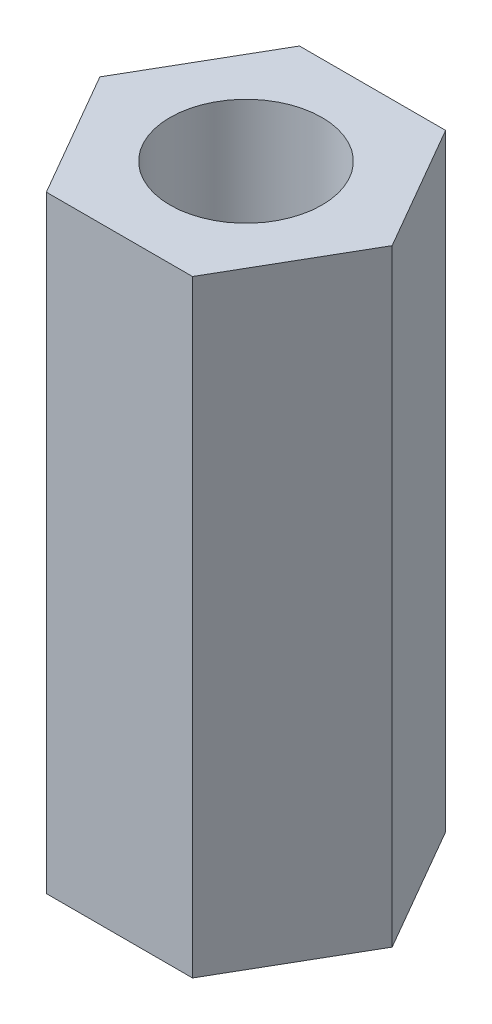
ISO-10303-21;
HEADER;
FILE_DESCRIPTION(('STEP AP214'),'2;1');
FILE_NAME('part.step','',(''),(''),'','','');
FILE_SCHEMA(('AUTOMOTIVE_DESIGN { 1 0 10303 214 1 1 1 1 }'));
ENDSEC;
DATA;
#1=APPLICATION_CONTEXT('core data for automotive mechanical design processes');
#2=APPLICATION_PROTOCOL_DEFINITION('international standard','automotive_design',2000,#1);
#3=PRODUCT_CONTEXT('',#1,'mechanical');
#4=PRODUCT('Part','Part','',(#3));
#5=PRODUCT_RELATED_PRODUCT_CATEGORY('part','',(#4));
#6=PRODUCT_DEFINITION_FORMATION('','',#4);
#7=PRODUCT_DEFINITION_CONTEXT('part definition',#1,'design');
#8=PRODUCT_DEFINITION('design','',#6,#7);
#9=PRODUCT_DEFINITION_SHAPE('','',#8);
#10=(LENGTH_UNIT() NAMED_UNIT(*) SI_UNIT(.MILLI.,.METRE.));
#11=(NAMED_UNIT(*) PLANE_ANGLE_UNIT() SI_UNIT($,.RADIAN.));
#12=(NAMED_UNIT(*) SI_UNIT($,.STERADIAN.) SOLID_ANGLE_UNIT());
#13=UNCERTAINTY_MEASURE_WITH_UNIT(LENGTH_MEASURE(1.E-05),#10,'distance_accuracy_value','');
#14=(GEOMETRIC_REPRESENTATION_CONTEXT(3) GLOBAL_UNCERTAINTY_ASSIGNED_CONTEXT((#13)) GLOBAL_UNIT_ASSIGNED_CONTEXT((#10,
#11,#12)) REPRESENTATION_CONTEXT('',''));
#15=CARTESIAN_POINT('',(0.,0.,0.));
#16=DIRECTION('',(0.,0.,1.));
#17=DIRECTION('',(1.,0.,0.));
#18=AXIS2_PLACEMENT_3D('',#15,#16,#17);
#19=CARTESIAN_POINT('',(0.,6.,0.));
#20=DIRECTION('',(0.,1.,0.));
#21=DIRECTION('',(0.,0.,1.));
#22=AXIS2_PLACEMENT_3D('',#19,#20,#21);
#23=PLANE('',#22);
#24=DIRECTION('',(1.,0.,0.));
#25=VECTOR('',#24,1.);
#26=CARTESIAN_POINT('',(-1.44337567297405,6.,2.5));
#27=LINE('',#26,#25);
#28=CARTESIAN_POINT('',(-1.44337567297405,6.,2.5));
#29=VERTEX_POINT('',#28);
#30=CARTESIAN_POINT('',(1.44337567297408,6.,2.5));
#31=VERTEX_POINT('',#30);
#32=EDGE_CURVE('E128',#29,#31,#27,.T.);
#33=ORIENTED_EDGE('',*,*,#32,.T.);
#34=DIRECTION('',(0.500000000000001,0.,-0.866025403784438));
#35=VECTOR('',#34,1.);
#36=CARTESIAN_POINT('',(1.44337567297408,6.,2.5));
#37=LINE('',#36,#35);
#38=CARTESIAN_POINT('',(2.88675134594815,6.,0.));
#39=VERTEX_POINT('',#38);
#40=EDGE_CURVE('E86',#31,#39,#37,.T.);
#41=ORIENTED_EDGE('',*,*,#40,.T.);
#42=DIRECTION('',(-0.500000000000001,0.,-0.866025403784438));
#43=VECTOR('',#42,1.);
#44=CARTESIAN_POINT('',(2.88675134594815,6.,0.));
#45=LINE('',#44,#43);
#46=CARTESIAN_POINT('',(1.44337567297408,6.,-2.50000000000001));
#47=VERTEX_POINT('',#46);
#48=EDGE_CURVE('E99',#39,#47,#45,.T.);
#49=ORIENTED_EDGE('',*,*,#48,.T.);
#50=DIRECTION('',(-1.,0.,0.));
#51=VECTOR('',#50,1.);
#52=CARTESIAN_POINT('',(1.44337567297408,6.,-2.50000000000001));
#53=LINE('',#52,#51);
#54=CARTESIAN_POINT('',(-1.44337567297405,6.,-2.50000000000001));
#55=VERTEX_POINT('',#54);
#56=EDGE_CURVE('E93',#47,#55,#53,.T.);
#57=ORIENTED_EDGE('',*,*,#56,.T.);
#58=DIRECTION('',(-0.5,0.,0.866025403784438));
#59=VECTOR('',#58,1.);
#60=CARTESIAN_POINT('',(-1.44337567297405,6.,-2.50000000000001));
#61=LINE('',#60,#59);
#62=CARTESIAN_POINT('',(-2.88675134594812,6.,0.));
#63=VERTEX_POINT('',#62);
#64=EDGE_CURVE('E97',#55,#63,#61,.T.);
#65=ORIENTED_EDGE('',*,*,#64,.T.);
#66=DIRECTION('',(0.5,0.,0.866025403784438));
#67=VECTOR('',#66,1.);
#68=CARTESIAN_POINT('',(-2.88675134594812,6.,0.));
#69=LINE('',#68,#67);
#70=EDGE_CURVE('E49',#63,#29,#69,.T.);
#71=ORIENTED_EDGE('',*,*,#70,.T.);
#72=EDGE_LOOP('',(#33,#41,#49,#57,#65,#71));
#73=FACE_BOUND('',#72,.T.);
#74=CARTESIAN_POINT('',(0.,6.,0.));
#75=DIRECTION('',(0.,1.,0.));
#76=DIRECTION('',(0.,0.,1.));
#77=AXIS2_PLACEMENT_3D('',#74,#75,#76);
#78=CIRCLE('',#77,1.5);
#79=CARTESIAN_POINT('',(0.,6.,1.5));
#80=VERTEX_POINT('',#79);
#81=EDGE_CURVE('E121',#80,#80,#78,.T.);
#82=ORIENTED_EDGE('',*,*,#81,.F.);
#83=EDGE_LOOP('',(#82));
#84=FACE_BOUND('',#83,.T.);
#85=ADVANCED_FACE('F32',(#73,#84),#23,.T.);
#86=CARTESIAN_POINT('',(0.,-6.,0.));
#87=DIRECTION('',(0.,1.,0.));
#88=DIRECTION('',(0.,0.,1.));
#89=AXIS2_PLACEMENT_3D('',#86,#87,#88);
#90=PLANE('',#89);
#91=DIRECTION('',(1.,0.,0.));
#92=VECTOR('',#91,1.);
#93=CARTESIAN_POINT('',(-1.44337567297405,-6.,2.5));
#94=LINE('',#93,#92);
#95=CARTESIAN_POINT('',(-1.44337567297405,-6.,2.5));
#96=VERTEX_POINT('',#95);
#97=CARTESIAN_POINT('',(1.44337567297408,-6.,2.5));
#98=VERTEX_POINT('',#97);
#99=EDGE_CURVE('E117',#96,#98,#94,.T.);
#100=ORIENTED_EDGE('',*,*,#99,.F.);
#101=DIRECTION('',(0.5,0.,0.866025403784438));
#102=VECTOR('',#101,1.);
#103=CARTESIAN_POINT('',(-2.88675134594812,-6.,0.));
#104=LINE('',#103,#102);
#105=CARTESIAN_POINT('',(-2.88675134594812,-6.,0.));
#106=VERTEX_POINT('',#105);
#107=EDGE_CURVE('E78',#106,#96,#104,.T.);
#108=ORIENTED_EDGE('',*,*,#107,.F.);
#109=DIRECTION('',(-0.5,0.,0.866025403784438));
#110=VECTOR('',#109,1.);
#111=CARTESIAN_POINT('',(-1.44337567297405,-6.,-2.50000000000001));
#112=LINE('',#111,#110);
#113=CARTESIAN_POINT('',(-1.44337567297405,-6.,-2.50000000000001));
#114=VERTEX_POINT('',#113);
#115=EDGE_CURVE('E72',#114,#106,#112,.T.);
#116=ORIENTED_EDGE('',*,*,#115,.F.);
#117=DIRECTION('',(-1.,0.,0.));
#118=VECTOR('',#117,1.);
#119=CARTESIAN_POINT('',(1.44337567297408,-6.,-2.50000000000001));
#120=LINE('',#119,#118);
#121=CARTESIAN_POINT('',(1.44337567297408,-6.,-2.50000000000001));
#122=VERTEX_POINT('',#121);
#123=EDGE_CURVE('E107',#122,#114,#120,.T.);
#124=ORIENTED_EDGE('',*,*,#123,.F.);
#125=DIRECTION('',(-0.500000000000001,0.,-0.866025403784438));
#126=VECTOR('',#125,1.);
#127=CARTESIAN_POINT('',(2.88675134594815,-6.,0.));
#128=LINE('',#127,#126);
#129=CARTESIAN_POINT('',(2.88675134594815,-6.,0.));
#130=VERTEX_POINT('',#129);
#131=EDGE_CURVE('E123',#130,#122,#128,.T.);
#132=ORIENTED_EDGE('',*,*,#131,.F.);
#133=DIRECTION('',(0.500000000000001,0.,-0.866025403784438));
#134=VECTOR('',#133,1.);
#135=CARTESIAN_POINT('',(1.44337567297408,-6.,2.5));
#136=LINE('',#135,#134);
#137=EDGE_CURVE('E120',#98,#130,#136,.T.);
#138=ORIENTED_EDGE('',*,*,#137,.F.);
#139=EDGE_LOOP('',(#100,#108,#116,#124,#132,#138));
#140=FACE_BOUND('',#139,.T.);
#141=CARTESIAN_POINT('',(0.,-6.,0.));
#142=DIRECTION('',(0.,1.,0.));
#143=DIRECTION('',(0.,0.,1.));
#144=AXIS2_PLACEMENT_3D('',#141,#142,#143);
#145=CIRCLE('',#144,1.5);
#146=CARTESIAN_POINT('',(0.,-6.,1.5));
#147=VERTEX_POINT('',#146);
#148=EDGE_CURVE('E221',#147,#147,#145,.T.);
#149=ORIENTED_EDGE('',*,*,#148,.T.);
#150=EDGE_LOOP('',(#149));
#151=FACE_BOUND('',#150,.T.);
#152=ADVANCED_FACE('F137',(#140,#151),#90,.F.);
#153=CARTESIAN_POINT('',(-1.44337567297405,6.,2.5));
#154=DIRECTION('',(0.,0.,-1.));
#155=DIRECTION('',(-1.,0.,0.));
#156=AXIS2_PLACEMENT_3D('',#153,#154,#155);
#157=PLANE('',#156);
#158=ORIENTED_EDGE('',*,*,#99,.T.);
#159=DIRECTION('',(0.,-1.,0.));
#160=VECTOR('',#159,1.);
#161=CARTESIAN_POINT('',(1.44337567297408,6.,2.5));
#162=LINE('',#161,#160);
#163=EDGE_CURVE('E11',#31,#98,#162,.T.);
#164=ORIENTED_EDGE('',*,*,#163,.F.);
#165=ORIENTED_EDGE('',*,*,#32,.F.);
#166=DIRECTION('',(0.,-1.,0.));
#167=VECTOR('',#166,1.);
#168=CARTESIAN_POINT('',(-1.44337567297405,6.,2.5));
#169=LINE('',#168,#167);
#170=EDGE_CURVE('E113',#29,#96,#169,.T.);
#171=ORIENTED_EDGE('',*,*,#170,.T.);
#172=EDGE_LOOP('',(#158,#164,#165,#171));
#173=FACE_BOUND('',#172,.T.);
#174=ADVANCED_FACE('F34',(#173),#157,.F.);
#175=CARTESIAN_POINT('',(1.44337567297408,6.,2.5));
#176=DIRECTION('',(-0.866025403784438,0.,-0.500000000000001));
#177=DIRECTION('',(-0.500000000000001,0.,0.866025403784438));
#178=AXIS2_PLACEMENT_3D('',#175,#176,#177);
#179=PLANE('',#178);
#180=ORIENTED_EDGE('',*,*,#137,.T.);
#181=DIRECTION('',(0.,-1.,0.));
#182=VECTOR('',#181,1.);
#183=CARTESIAN_POINT('',(2.88675134594815,6.,0.));
#184=LINE('',#183,#182);
#185=EDGE_CURVE('E41',#39,#130,#184,.T.);
#186=ORIENTED_EDGE('',*,*,#185,.F.);
#187=ORIENTED_EDGE('',*,*,#40,.F.);
#188=ORIENTED_EDGE('',*,*,#163,.T.);
#189=EDGE_LOOP('',(#180,#186,#187,#188));
#190=FACE_BOUND('',#189,.T.);
#191=ADVANCED_FACE('F162',(#190),#179,.F.);
#192=CARTESIAN_POINT('',(2.88675134594815,6.,0.));
#193=DIRECTION('',(-0.866025403784438,0.,0.500000000000001));
#194=DIRECTION('',(0.500000000000001,0.,0.866025403784438));
#195=AXIS2_PLACEMENT_3D('',#192,#193,#194);
#196=PLANE('',#195);
#197=ORIENTED_EDGE('',*,*,#131,.T.);
#198=DIRECTION('',(0.,-1.,0.));
#199=VECTOR('',#198,1.);
#200=CARTESIAN_POINT('',(1.44337567297408,6.,-2.50000000000001));
#201=LINE('',#200,#199);
#202=EDGE_CURVE('E108',#47,#122,#201,.T.);
#203=ORIENTED_EDGE('',*,*,#202,.F.);
#204=ORIENTED_EDGE('',*,*,#48,.F.);
#205=ORIENTED_EDGE('',*,*,#185,.T.);
#206=EDGE_LOOP('',(#197,#203,#204,#205));
#207=FACE_BOUND('',#206,.T.);
#208=ADVANCED_FACE('F134',(#207),#196,.F.);
#209=CARTESIAN_POINT('',(1.44337567297408,6.,-2.50000000000001));
#210=DIRECTION('',(0.,0.,1.));
#211=DIRECTION('',(1.,0.,0.));
#212=AXIS2_PLACEMENT_3D('',#209,#210,#211);
#213=PLANE('',#212);
#214=ORIENTED_EDGE('',*,*,#123,.T.);
#215=DIRECTION('',(0.,-1.,0.));
#216=VECTOR('',#215,1.);
#217=CARTESIAN_POINT('',(-1.44337567297405,6.,-2.50000000000001));
#218=LINE('',#217,#216);
#219=EDGE_CURVE('E104',#55,#114,#218,.T.);
#220=ORIENTED_EDGE('',*,*,#219,.F.);
#221=ORIENTED_EDGE('',*,*,#56,.F.);
#222=ORIENTED_EDGE('',*,*,#202,.T.);
#223=EDGE_LOOP('',(#214,#220,#221,#222));
#224=FACE_BOUND('',#223,.T.);
#225=ADVANCED_FACE('F105',(#224),#213,.F.);
#226=CARTESIAN_POINT('',(-1.44337567297405,6.,-2.50000000000001));
#227=DIRECTION('',(0.866025403784439,0.,0.5));
#228=DIRECTION('',(0.5,0.,-0.866025403784439));
#229=AXIS2_PLACEMENT_3D('',#226,#227,#228);
#230=PLANE('',#229);
#231=ORIENTED_EDGE('',*,*,#115,.T.);
#232=DIRECTION('',(0.,-1.,0.));
#233=VECTOR('',#232,1.);
#234=CARTESIAN_POINT('',(-2.88675134594812,6.,0.));
#235=LINE('',#234,#233);
#236=EDGE_CURVE('E109',#63,#106,#235,.T.);
#237=ORIENTED_EDGE('',*,*,#236,.F.);
#238=ORIENTED_EDGE('',*,*,#64,.F.);
#239=ORIENTED_EDGE('',*,*,#219,.T.);
#240=EDGE_LOOP('',(#231,#237,#238,#239));
#241=FACE_BOUND('',#240,.T.);
#242=ADVANCED_FACE('F111',(#241),#230,.F.);
#243=CARTESIAN_POINT('',(-2.88675134594812,6.,0.));
#244=DIRECTION('',(0.866025403784438,0.,-0.500000000000001));
#245=DIRECTION('',(-0.500000000000001,0.,-0.866025403784438));
#246=AXIS2_PLACEMENT_3D('',#243,#244,#245);
#247=PLANE('',#246);
#248=ORIENTED_EDGE('',*,*,#107,.T.);
#249=ORIENTED_EDGE('',*,*,#170,.F.);
#250=ORIENTED_EDGE('',*,*,#70,.F.);
#251=ORIENTED_EDGE('',*,*,#236,.T.);
#252=EDGE_LOOP('',(#248,#249,#250,#251));
#253=FACE_BOUND('',#252,.T.);
#254=ADVANCED_FACE('F142',(#253),#247,.F.);
#255=CARTESIAN_POINT('',(0.,6.,0.));
#256=DIRECTION('',(0.,-1.,0.));
#257=DIRECTION('',(0.,0.,-1.));
#258=AXIS2_PLACEMENT_3D('',#255,#256,#257);
#259=CYLINDRICAL_SURFACE('',#258,1.5);
#260=ORIENTED_EDGE('',*,*,#81,.T.);
#261=EDGE_LOOP('',(#260));
#262=FACE_BOUND('',#261,.T.);
#263=ORIENTED_EDGE('',*,*,#148,.F.);
#264=EDGE_LOOP('',(#263));
#265=FACE_BOUND('',#264,.T.);
#266=ADVANCED_FACE('F144',(#262,#265),#259,.F.);
#267=CLOSED_SHELL('',(#85,#152,#174,#191,#208,#225,#242,#254,#266));
#268=MANIFOLD_SOLID_BREP('B2',#267);
#269=ADVANCED_BREP_SHAPE_REPRESENTATION('',(#18,#268),#14);
#270=SHAPE_DEFINITION_REPRESENTATION(#9,#269);
ENDSEC;
END-ISO-10303-21;
